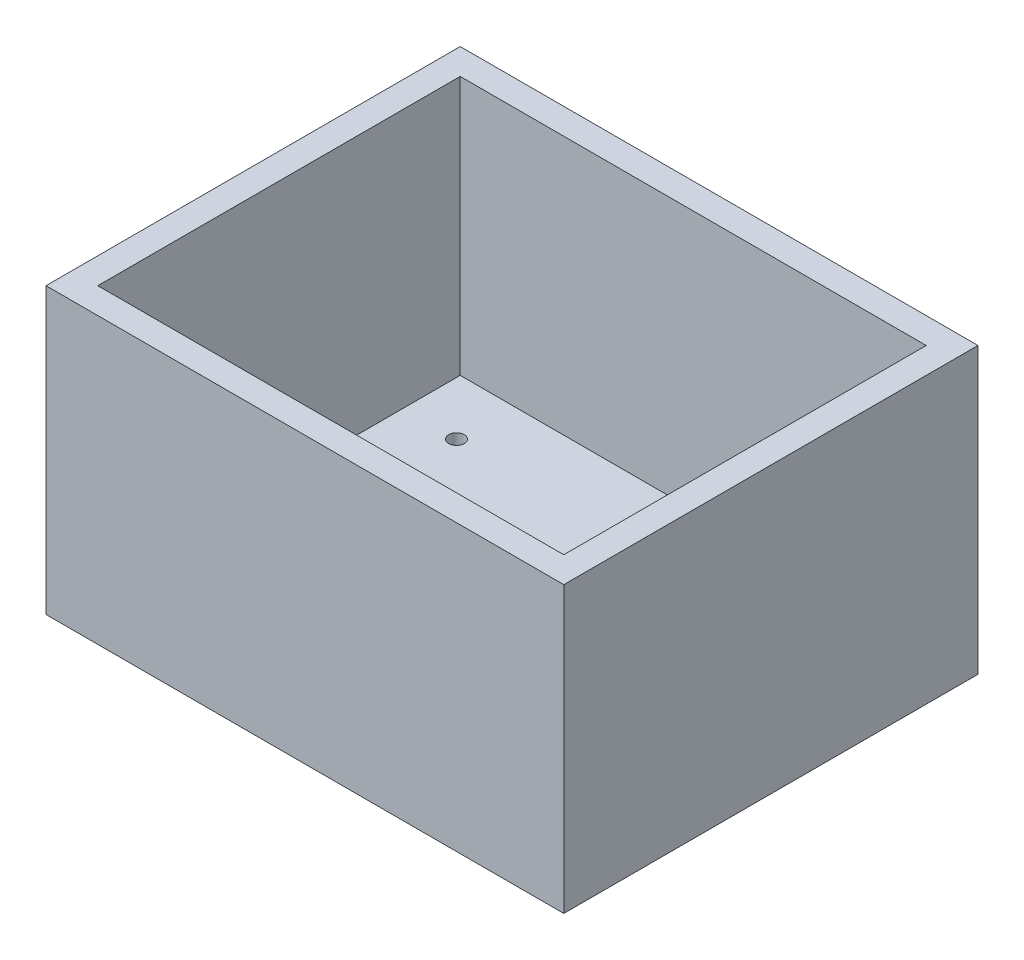
ISO-10303-21;
HEADER;
FILE_DESCRIPTION(('STEP AP214'),'2;1');
FILE_NAME('part.step','',(''),(''),'','','');
FILE_SCHEMA(('AUTOMOTIVE_DESIGN { 1 0 10303 214 1 1 1 1 }'));
ENDSEC;
DATA;
#1=APPLICATION_CONTEXT('core data for automotive mechanical design processes');
#2=APPLICATION_PROTOCOL_DEFINITION('international standard','automotive_design',2000,#1);
#3=PRODUCT_CONTEXT('',#1,'mechanical');
#4=PRODUCT('Part','Part','',(#3));
#5=PRODUCT_RELATED_PRODUCT_CATEGORY('part','',(#4));
#6=PRODUCT_DEFINITION_FORMATION('','',#4);
#7=PRODUCT_DEFINITION_CONTEXT('part definition',#1,'design');
#8=PRODUCT_DEFINITION('design','',#6,#7);
#9=PRODUCT_DEFINITION_SHAPE('','',#8);
#10=(LENGTH_UNIT() NAMED_UNIT(*) SI_UNIT(.MILLI.,.METRE.));
#11=(NAMED_UNIT(*) PLANE_ANGLE_UNIT() SI_UNIT($,.RADIAN.));
#12=(NAMED_UNIT(*) SI_UNIT($,.STERADIAN.) SOLID_ANGLE_UNIT());
#13=UNCERTAINTY_MEASURE_WITH_UNIT(LENGTH_MEASURE(1.E-05),#10,'distance_accuracy_value','');
#14=(GEOMETRIC_REPRESENTATION_CONTEXT(3) GLOBAL_UNCERTAINTY_ASSIGNED_CONTEXT((#13)) GLOBAL_UNIT_ASSIGNED_CONTEXT((#10,
#11,#12)) REPRESENTATION_CONTEXT('',''));
#15=CARTESIAN_POINT('',(0.,0.,0.));
#16=DIRECTION('',(0.,0.,1.));
#17=DIRECTION('',(1.,0.,0.));
#18=AXIS2_PLACEMENT_3D('',#15,#16,#17);
#19=CARTESIAN_POINT('',(50.,55.,-40.));
#20=DIRECTION('',(-1.,0.,0.));
#21=DIRECTION('',(0.,0.,1.));
#22=AXIS2_PLACEMENT_3D('',#19,#20,#21);
#23=PLANE('',#22);
#24=DIRECTION('',(0.,0.,-1.));
#25=VECTOR('',#24,1.);
#26=CARTESIAN_POINT('',(50.,0.,-40.));
#27=LINE('',#26,#25);
#28=CARTESIAN_POINT('',(50.,0.,40.));
#29=VERTEX_POINT('',#28);
#30=CARTESIAN_POINT('',(50.,0.,-40.));
#31=VERTEX_POINT('',#30);
#32=EDGE_CURVE('E161',#29,#31,#27,.T.);
#33=ORIENTED_EDGE('',*,*,#32,.T.);
#34=DIRECTION('',(0.,-1.,0.));
#35=VECTOR('',#34,1.);
#36=CARTESIAN_POINT('',(50.,55.,-40.));
#37=LINE('',#36,#35);
#38=CARTESIAN_POINT('',(50.,55.,-40.));
#39=VERTEX_POINT('',#38);
#40=EDGE_CURVE('E11',#39,#31,#37,.T.);
#41=ORIENTED_EDGE('',*,*,#40,.F.);
#42=DIRECTION('',(0.,0.,-1.));
#43=VECTOR('',#42,1.);
#44=CARTESIAN_POINT('',(50.,55.,-40.));
#45=LINE('',#44,#43);
#46=CARTESIAN_POINT('',(50.,55.,40.));
#47=VERTEX_POINT('',#46);
#48=EDGE_CURVE('E167',#47,#39,#45,.T.);
#49=ORIENTED_EDGE('',*,*,#48,.F.);
#50=DIRECTION('',(0.,-1.,0.));
#51=VECTOR('',#50,1.);
#52=CARTESIAN_POINT('',(50.,55.,40.));
#53=LINE('',#52,#51);
#54=EDGE_CURVE('E177',#47,#29,#53,.T.);
#55=ORIENTED_EDGE('',*,*,#54,.T.);
#56=EDGE_LOOP('',(#33,#41,#49,#55));
#57=FACE_BOUND('',#56,.T.);
#58=ADVANCED_FACE('F39',(#57),#23,.F.);
#59=CARTESIAN_POINT('',(-50.,55.,-40.));
#60=DIRECTION('',(0.,0.,1.));
#61=DIRECTION('',(1.,0.,0.));
#62=AXIS2_PLACEMENT_3D('',#59,#60,#61);
#63=PLANE('',#62);
#64=DIRECTION('',(-1.,0.,0.));
#65=VECTOR('',#64,1.);
#66=CARTESIAN_POINT('',(-50.,0.,-40.));
#67=LINE('',#66,#65);
#68=CARTESIAN_POINT('',(-50.,0.,-40.));
#69=VERTEX_POINT('',#68);
#70=EDGE_CURVE('E181',#31,#69,#67,.T.);
#71=ORIENTED_EDGE('',*,*,#70,.T.);
#72=DIRECTION('',(0.,-1.,0.));
#73=VECTOR('',#72,1.);
#74=CARTESIAN_POINT('',(-50.,55.,-40.));
#75=LINE('',#74,#73);
#76=CARTESIAN_POINT('',(-50.,55.,-40.));
#77=VERTEX_POINT('',#76);
#78=EDGE_CURVE('E47',#77,#69,#75,.T.);
#79=ORIENTED_EDGE('',*,*,#78,.F.);
#80=DIRECTION('',(-1.,0.,0.));
#81=VECTOR('',#80,1.);
#82=CARTESIAN_POINT('',(-50.,55.,-40.));
#83=LINE('',#82,#81);
#84=EDGE_CURVE('E91',#39,#77,#83,.T.);
#85=ORIENTED_EDGE('',*,*,#84,.F.);
#86=ORIENTED_EDGE('',*,*,#40,.T.);
#87=EDGE_LOOP('',(#71,#79,#85,#86));
#88=FACE_BOUND('',#87,.T.);
#89=ADVANCED_FACE('F216',(#88),#63,.F.);
#90=CARTESIAN_POINT('',(-50.,55.,-40.));
#91=DIRECTION('',(1.,0.,0.));
#92=DIRECTION('',(0.,0.,-1.));
#93=AXIS2_PLACEMENT_3D('',#90,#91,#92);
#94=PLANE('',#93);
#95=DIRECTION('',(0.,0.,1.));
#96=VECTOR('',#95,1.);
#97=CARTESIAN_POINT('',(-50.,0.,-40.));
#98=LINE('',#97,#96);
#99=CARTESIAN_POINT('',(-50.,0.,40.));
#100=VERTEX_POINT('',#99);
#101=EDGE_CURVE('E184',#69,#100,#98,.T.);
#102=ORIENTED_EDGE('',*,*,#101,.T.);
#103=DIRECTION('',(0.,-1.,0.));
#104=VECTOR('',#103,1.);
#105=CARTESIAN_POINT('',(-50.,55.,40.));
#106=LINE('',#105,#104);
#107=CARTESIAN_POINT('',(-50.,55.,40.));
#108=VERTEX_POINT('',#107);
#109=EDGE_CURVE('E191',#108,#100,#106,.T.);
#110=ORIENTED_EDGE('',*,*,#109,.F.);
#111=DIRECTION('',(0.,0.,1.));
#112=VECTOR('',#111,1.);
#113=CARTESIAN_POINT('',(-50.,55.,-40.));
#114=LINE('',#113,#112);
#115=EDGE_CURVE('E172',#77,#108,#114,.T.);
#116=ORIENTED_EDGE('',*,*,#115,.F.);
#117=ORIENTED_EDGE('',*,*,#78,.T.);
#118=EDGE_LOOP('',(#102,#110,#116,#117));
#119=FACE_BOUND('',#118,.T.);
#120=ADVANCED_FACE('F198',(#119),#94,.F.);
#121=CARTESIAN_POINT('',(-50.,55.,40.));
#122=DIRECTION('',(0.,0.,-1.));
#123=DIRECTION('',(-1.,0.,0.));
#124=AXIS2_PLACEMENT_3D('',#121,#122,#123);
#125=PLANE('',#124);
#126=DIRECTION('',(1.,0.,0.));
#127=VECTOR('',#126,1.);
#128=CARTESIAN_POINT('',(-50.,0.,40.));
#129=LINE('',#128,#127);
#130=EDGE_CURVE('E84',#100,#29,#129,.T.);
#131=ORIENTED_EDGE('',*,*,#130,.T.);
#132=ORIENTED_EDGE('',*,*,#54,.F.);
#133=DIRECTION('',(1.,0.,0.));
#134=VECTOR('',#133,1.);
#135=CARTESIAN_POINT('',(-50.,55.,40.));
#136=LINE('',#135,#134);
#137=EDGE_CURVE('E63',#108,#47,#136,.T.);
#138=ORIENTED_EDGE('',*,*,#137,.F.);
#139=ORIENTED_EDGE('',*,*,#109,.T.);
#140=EDGE_LOOP('',(#131,#132,#138,#139));
#141=FACE_BOUND('',#140,.T.);
#142=ADVANCED_FACE('F206',(#141),#125,.F.);
#143=CARTESIAN_POINT('',(0.,55.,0.));
#144=DIRECTION('',(0.,1.,0.));
#145=DIRECTION('',(0.,0.,1.));
#146=AXIS2_PLACEMENT_3D('',#143,#144,#145);
#147=PLANE('',#146);
#148=DIRECTION('',(0.,0.,-1.));
#149=VECTOR('',#148,1.);
#150=CARTESIAN_POINT('',(45.,55.,-35.));
#151=LINE('',#150,#149);
#152=CARTESIAN_POINT('',(45.,55.,35.));
#153=VERTEX_POINT('',#152);
#154=CARTESIAN_POINT('',(45.,55.,-35.));
#155=VERTEX_POINT('',#154);
#156=EDGE_CURVE('E54',#153,#155,#151,.T.);
#157=ORIENTED_EDGE('',*,*,#156,.F.);
#158=DIRECTION('',(1.,0.,0.));
#159=VECTOR('',#158,1.);
#160=CARTESIAN_POINT('',(-45.,55.,35.));
#161=LINE('',#160,#159);
#162=CARTESIAN_POINT('',(-45.,55.,35.));
#163=VERTEX_POINT('',#162);
#164=EDGE_CURVE('E136',#163,#153,#161,.T.);
#165=ORIENTED_EDGE('',*,*,#164,.F.);
#166=DIRECTION('',(0.,0.,1.));
#167=VECTOR('',#166,1.);
#168=CARTESIAN_POINT('',(-45.,55.,-35.));
#169=LINE('',#168,#167);
#170=CARTESIAN_POINT('',(-45.,55.,-35.));
#171=VERTEX_POINT('',#170);
#172=EDGE_CURVE('E140',#171,#163,#169,.T.);
#173=ORIENTED_EDGE('',*,*,#172,.F.);
#174=DIRECTION('',(-1.,0.,0.));
#175=VECTOR('',#174,1.);
#176=CARTESIAN_POINT('',(-45.,55.,-35.));
#177=LINE('',#176,#175);
#178=EDGE_CURVE('E152',#155,#171,#177,.T.);
#179=ORIENTED_EDGE('',*,*,#178,.F.);
#180=EDGE_LOOP('',(#157,#165,#173,#179));
#181=FACE_BOUND('',#180,.T.);
#182=ORIENTED_EDGE('',*,*,#48,.T.);
#183=ORIENTED_EDGE('',*,*,#84,.T.);
#184=ORIENTED_EDGE('',*,*,#115,.T.);
#185=ORIENTED_EDGE('',*,*,#137,.T.);
#186=EDGE_LOOP('',(#182,#183,#184,#185));
#187=FACE_BOUND('',#186,.T.);
#188=ADVANCED_FACE('F208',(#181,#187),#147,.T.);
#189=CARTESIAN_POINT('',(0.,0.,0.));
#190=DIRECTION('',(0.,1.,0.));
#191=DIRECTION('',(0.,0.,1.));
#192=AXIS2_PLACEMENT_3D('',#189,#190,#191);
#193=PLANE('',#192);
#194=CARTESIAN_POINT('',(-34.7015041380897,0.,23.9833025541536));
#195=DIRECTION('',(0.,1.,0.));
#196=DIRECTION('',(0.,0.,1.));
#197=AXIS2_PLACEMENT_3D('',#194,#195,#196);
#198=CIRCLE('',#197,1.5);
#199=CARTESIAN_POINT('',(-34.7015041380897,0.,25.4833025541536));
#200=VERTEX_POINT('',#199);
#201=EDGE_CURVE('E143',#200,#200,#198,.T.);
#202=ORIENTED_EDGE('',*,*,#201,.T.);
#203=EDGE_LOOP('',(#202));
#204=FACE_BOUND('',#203,.T.);
#205=CARTESIAN_POINT('',(34.7015041380897,0.,23.9833025541536));
#206=DIRECTION('',(0.,1.,0.));
#207=DIRECTION('',(0.,0.,1.));
#208=AXIS2_PLACEMENT_3D('',#205,#206,#207);
#209=CIRCLE('',#208,1.5);
#210=CARTESIAN_POINT('',(34.7015041380897,0.,25.4833025541536));
#211=VERTEX_POINT('',#210);
#212=EDGE_CURVE('E343',#211,#211,#209,.T.);
#213=ORIENTED_EDGE('',*,*,#212,.T.);
#214=EDGE_LOOP('',(#213));
#215=FACE_BOUND('',#214,.T.);
#216=CARTESIAN_POINT('',(34.7015041380897,0.,-23.9833025541536));
#217=DIRECTION('',(0.,1.,0.));
#218=DIRECTION('',(0.,0.,1.));
#219=AXIS2_PLACEMENT_3D('',#216,#217,#218);
#220=CIRCLE('',#219,1.5);
#221=CARTESIAN_POINT('',(34.7015041380897,0.,-22.4833025541536));
#222=VERTEX_POINT('',#221);
#223=EDGE_CURVE('E346',#222,#222,#220,.T.);
#224=ORIENTED_EDGE('',*,*,#223,.T.);
#225=EDGE_LOOP('',(#224));
#226=FACE_BOUND('',#225,.T.);
#227=CARTESIAN_POINT('',(-34.7015041380897,0.,-23.9833025541536));
#228=DIRECTION('',(0.,1.,0.));
#229=DIRECTION('',(0.,0.,1.));
#230=AXIS2_PLACEMENT_3D('',#227,#228,#229);
#231=CIRCLE('',#230,1.5);
#232=CARTESIAN_POINT('',(-34.7015041380897,0.,-22.4833025541536));
#233=VERTEX_POINT('',#232);
#234=EDGE_CURVE('E351',#233,#233,#231,.T.);
#235=ORIENTED_EDGE('',*,*,#234,.T.);
#236=EDGE_LOOP('',(#235));
#237=FACE_BOUND('',#236,.T.);
#238=ORIENTED_EDGE('',*,*,#32,.F.);
#239=ORIENTED_EDGE('',*,*,#130,.F.);
#240=ORIENTED_EDGE('',*,*,#101,.F.);
#241=ORIENTED_EDGE('',*,*,#70,.F.);
#242=EDGE_LOOP('',(#238,#239,#240,#241));
#243=FACE_BOUND('',#242,.T.);
#244=ADVANCED_FACE('F202',(#204,#215,#226,#237,#243),#193,.F.);
#245=CARTESIAN_POINT('',(45.,5.,-35.));
#246=DIRECTION('',(1.,0.,0.));
#247=DIRECTION('',(0.,0.,-1.));
#248=AXIS2_PLACEMENT_3D('',#245,#246,#247);
#249=PLANE('',#248);
#250=ORIENTED_EDGE('',*,*,#156,.T.);
#251=DIRECTION('',(0.,1.,0.));
#252=VECTOR('',#251,1.);
#253=CARTESIAN_POINT('',(45.,5.,-35.));
#254=LINE('',#253,#252);
#255=CARTESIAN_POINT('',(45.,5.,-35.));
#256=VERTEX_POINT('',#255);
#257=EDGE_CURVE('E111',#256,#155,#254,.T.);
#258=ORIENTED_EDGE('',*,*,#257,.F.);
#259=DIRECTION('',(0.,0.,-1.));
#260=VECTOR('',#259,1.);
#261=CARTESIAN_POINT('',(45.,5.,-35.));
#262=LINE('',#261,#260);
#263=CARTESIAN_POINT('',(45.,5.,35.));
#264=VERTEX_POINT('',#263);
#265=EDGE_CURVE('E115',#264,#256,#262,.T.);
#266=ORIENTED_EDGE('',*,*,#265,.F.);
#267=DIRECTION('',(0.,1.,0.));
#268=VECTOR('',#267,1.);
#269=CARTESIAN_POINT('',(45.,5.,35.));
#270=LINE('',#269,#268);
#271=EDGE_CURVE('E158',#264,#153,#270,.T.);
#272=ORIENTED_EDGE('',*,*,#271,.T.);
#273=EDGE_LOOP('',(#250,#258,#266,#272));
#274=FACE_BOUND('',#273,.T.);
#275=ADVANCED_FACE('F113',(#274),#249,.F.);
#276=CARTESIAN_POINT('',(-45.,5.,35.));
#277=DIRECTION('',(0.,0.,1.));
#278=DIRECTION('',(1.,0.,0.));
#279=AXIS2_PLACEMENT_3D('',#276,#277,#278);
#280=PLANE('',#279);
#281=ORIENTED_EDGE('',*,*,#164,.T.);
#282=ORIENTED_EDGE('',*,*,#271,.F.);
#283=DIRECTION('',(1.,0.,0.));
#284=VECTOR('',#283,1.);
#285=CARTESIAN_POINT('',(-45.,5.,35.));
#286=LINE('',#285,#284);
#287=CARTESIAN_POINT('',(-45.,5.,35.));
#288=VERTEX_POINT('',#287);
#289=EDGE_CURVE('E122',#288,#264,#286,.T.);
#290=ORIENTED_EDGE('',*,*,#289,.F.);
#291=DIRECTION('',(0.,1.,0.));
#292=VECTOR('',#291,1.);
#293=CARTESIAN_POINT('',(-45.,5.,35.));
#294=LINE('',#293,#292);
#295=EDGE_CURVE('E162',#288,#163,#294,.T.);
#296=ORIENTED_EDGE('',*,*,#295,.T.);
#297=EDGE_LOOP('',(#281,#282,#290,#296));
#298=FACE_BOUND('',#297,.T.);
#299=ADVANCED_FACE('F250',(#298),#280,.F.);
#300=CARTESIAN_POINT('',(-45.,5.,-35.));
#301=DIRECTION('',(-1.,0.,0.));
#302=DIRECTION('',(0.,0.,1.));
#303=AXIS2_PLACEMENT_3D('',#300,#301,#302);
#304=PLANE('',#303);
#305=ORIENTED_EDGE('',*,*,#172,.T.);
#306=ORIENTED_EDGE('',*,*,#295,.F.);
#307=DIRECTION('',(0.,0.,1.));
#308=VECTOR('',#307,1.);
#309=CARTESIAN_POINT('',(-45.,5.,-35.));
#310=LINE('',#309,#308);
#311=CARTESIAN_POINT('',(-45.,5.,-35.));
#312=VERTEX_POINT('',#311);
#313=EDGE_CURVE('E131',#312,#288,#310,.T.);
#314=ORIENTED_EDGE('',*,*,#313,.F.);
#315=DIRECTION('',(0.,1.,0.));
#316=VECTOR('',#315,1.);
#317=CARTESIAN_POINT('',(-45.,5.,-35.));
#318=LINE('',#317,#316);
#319=EDGE_CURVE('E121',#312,#171,#318,.T.);
#320=ORIENTED_EDGE('',*,*,#319,.T.);
#321=EDGE_LOOP('',(#305,#306,#314,#320));
#322=FACE_BOUND('',#321,.T.);
#323=ADVANCED_FACE('F259',(#322),#304,.F.);
#324=CARTESIAN_POINT('',(-45.,5.,-35.));
#325=DIRECTION('',(0.,0.,-1.));
#326=DIRECTION('',(-1.,0.,0.));
#327=AXIS2_PLACEMENT_3D('',#324,#325,#326);
#328=PLANE('',#327);
#329=ORIENTED_EDGE('',*,*,#178,.T.);
#330=ORIENTED_EDGE('',*,*,#319,.F.);
#331=DIRECTION('',(-1.,0.,0.));
#332=VECTOR('',#331,1.);
#333=CARTESIAN_POINT('',(-45.,5.,-35.));
#334=LINE('',#333,#332);
#335=EDGE_CURVE('E125',#256,#312,#334,.T.);
#336=ORIENTED_EDGE('',*,*,#335,.F.);
#337=ORIENTED_EDGE('',*,*,#257,.T.);
#338=EDGE_LOOP('',(#329,#330,#336,#337));
#339=FACE_BOUND('',#338,.T.);
#340=ADVANCED_FACE('F126',(#339),#328,.F.);
#341=CARTESIAN_POINT('',(0.,5.,0.));
#342=DIRECTION('',(0.,1.,0.));
#343=DIRECTION('',(0.,0.,1.));
#344=AXIS2_PLACEMENT_3D('',#341,#342,#343);
#345=PLANE('',#344);
#346=CARTESIAN_POINT('',(-34.7015041380897,5.,23.9833025541536));
#347=DIRECTION('',(0.,1.,0.));
#348=DIRECTION('',(0.,0.,-1.));
#349=AXIS2_PLACEMENT_3D('',#346,#347,#348);
#350=CIRCLE('',#349,1.5);
#351=CARTESIAN_POINT('',(-34.7015041380897,5.,22.4833025541536));
#352=VERTEX_POINT('',#351);
#353=EDGE_CURVE('E339',#352,#352,#350,.T.);
#354=ORIENTED_EDGE('',*,*,#353,.F.);
#355=EDGE_LOOP('',(#354));
#356=FACE_BOUND('',#355,.T.);
#357=CARTESIAN_POINT('',(34.7015041380897,5.,23.9833025541536));
#358=DIRECTION('',(0.,1.,0.));
#359=DIRECTION('',(0.,0.,1.));
#360=AXIS2_PLACEMENT_3D('',#357,#358,#359);
#361=CIRCLE('',#360,1.5);
#362=CARTESIAN_POINT('',(34.7015041380897,5.,25.4833025541536));
#363=VERTEX_POINT('',#362);
#364=EDGE_CURVE('E364',#363,#363,#361,.T.);
#365=ORIENTED_EDGE('',*,*,#364,.F.);
#366=EDGE_LOOP('',(#365));
#367=FACE_BOUND('',#366,.T.);
#368=CARTESIAN_POINT('',(34.7015041380897,5.,-23.9833025541536));
#369=DIRECTION('',(0.,1.,0.));
#370=DIRECTION('',(0.,0.,-1.));
#371=AXIS2_PLACEMENT_3D('',#368,#369,#370);
#372=CIRCLE('',#371,1.5);
#373=CARTESIAN_POINT('',(34.7015041380897,5.,-25.4833025541536));
#374=VERTEX_POINT('',#373);
#375=EDGE_CURVE('E361',#374,#374,#372,.T.);
#376=ORIENTED_EDGE('',*,*,#375,.F.);
#377=EDGE_LOOP('',(#376));
#378=FACE_BOUND('',#377,.T.);
#379=CARTESIAN_POINT('',(-34.7015041380897,5.,-23.9833025541536));
#380=DIRECTION('',(0.,1.,0.));
#381=DIRECTION('',(0.,0.,1.));
#382=AXIS2_PLACEMENT_3D('',#379,#380,#381);
#383=CIRCLE('',#382,1.5);
#384=CARTESIAN_POINT('',(-34.7015041380897,5.,-22.4833025541536));
#385=VERTEX_POINT('',#384);
#386=EDGE_CURVE('E357',#385,#385,#383,.T.);
#387=ORIENTED_EDGE('',*,*,#386,.F.);
#388=EDGE_LOOP('',(#387));
#389=FACE_BOUND('',#388,.T.);
#390=ORIENTED_EDGE('',*,*,#265,.T.);
#391=ORIENTED_EDGE('',*,*,#335,.T.);
#392=ORIENTED_EDGE('',*,*,#313,.T.);
#393=ORIENTED_EDGE('',*,*,#289,.T.);
#394=EDGE_LOOP('',(#390,#391,#392,#393));
#395=FACE_BOUND('',#394,.T.);
#396=ADVANCED_FACE('F133',(#356,#367,#378,#389,#395),#345,.T.);
#397=CARTESIAN_POINT('',(-34.7015041380897,-45.,-23.9833025541536));
#398=DIRECTION('',(0.,1.,0.));
#399=DIRECTION('',(0.,0.,1.));
#400=AXIS2_PLACEMENT_3D('',#397,#398,#399);
#401=CYLINDRICAL_SURFACE('',#400,1.5);
#402=ORIENTED_EDGE('',*,*,#386,.T.);
#403=EDGE_LOOP('',(#402));
#404=FACE_BOUND('',#403,.T.);
#405=ORIENTED_EDGE('',*,*,#234,.F.);
#406=EDGE_LOOP('',(#405));
#407=FACE_BOUND('',#406,.T.);
#408=ADVANCED_FACE('F292',(#404,#407),#401,.F.);
#409=CARTESIAN_POINT('',(34.7015041380897,-45.,-23.9833025541536));
#410=DIRECTION('',(0.,1.,0.));
#411=DIRECTION('',(0.,0.,1.));
#412=AXIS2_PLACEMENT_3D('',#409,#410,#411);
#413=CYLINDRICAL_SURFACE('',#412,1.5);
#414=ORIENTED_EDGE('',*,*,#375,.T.);
#415=EDGE_LOOP('',(#414));
#416=FACE_BOUND('',#415,.T.);
#417=ORIENTED_EDGE('',*,*,#223,.F.);
#418=EDGE_LOOP('',(#417));
#419=FACE_BOUND('',#418,.T.);
#420=ADVANCED_FACE('F302',(#416,#419),#413,.F.);
#421=CARTESIAN_POINT('',(34.7015041380897,-45.,23.9833025541536));
#422=DIRECTION('',(0.,1.,0.));
#423=DIRECTION('',(0.,0.,1.));
#424=AXIS2_PLACEMENT_3D('',#421,#422,#423);
#425=CYLINDRICAL_SURFACE('',#424,1.5);
#426=ORIENTED_EDGE('',*,*,#364,.T.);
#427=EDGE_LOOP('',(#426));
#428=FACE_BOUND('',#427,.T.);
#429=ORIENTED_EDGE('',*,*,#212,.F.);
#430=EDGE_LOOP('',(#429));
#431=FACE_BOUND('',#430,.T.);
#432=ADVANCED_FACE('F312',(#428,#431),#425,.F.);
#433=CARTESIAN_POINT('',(-34.7015041380897,-45.,23.9833025541536));
#434=DIRECTION('',(0.,1.,0.));
#435=DIRECTION('',(0.,0.,1.));
#436=AXIS2_PLACEMENT_3D('',#433,#434,#435);
#437=CYLINDRICAL_SURFACE('',#436,1.5);
#438=ORIENTED_EDGE('',*,*,#353,.T.);
#439=EDGE_LOOP('',(#438));
#440=FACE_BOUND('',#439,.T.);
#441=ORIENTED_EDGE('',*,*,#201,.F.);
#442=EDGE_LOOP('',(#441));
#443=FACE_BOUND('',#442,.T.);
#444=ADVANCED_FACE('F322',(#440,#443),#437,.F.);
#445=CLOSED_SHELL('',(#58,#89,#120,#142,#188,#244,#275,#299,#323,#340,#396,#408,#420,#432,#444));
#446=MANIFOLD_SOLID_BREP('B2',#445);
#447=ADVANCED_BREP_SHAPE_REPRESENTATION('',(#18,#446),#14);
#448=SHAPE_DEFINITION_REPRESENTATION(#9,#447);
ENDSEC;
END-ISO-10303-21;
